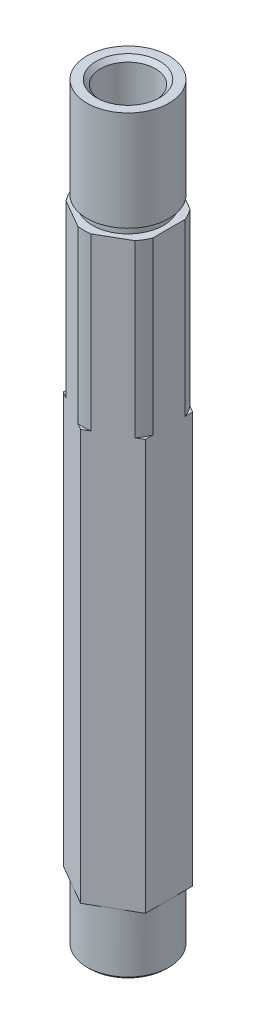
ISO-10303-21;
HEADER;
FILE_DESCRIPTION(('STEP AP214'),'2;1');
FILE_NAME('part.step','',(''),(''),'','','');
FILE_SCHEMA(('AUTOMOTIVE_DESIGN { 1 0 10303 214 1 1 1 1 }'));
ENDSEC;
DATA;
#1=APPLICATION_CONTEXT('core data for automotive mechanical design processes');
#2=APPLICATION_PROTOCOL_DEFINITION('international standard','automotive_design',2000,#1);
#3=PRODUCT_CONTEXT('',#1,'mechanical');
#4=PRODUCT('Part','Part','',(#3));
#5=PRODUCT_RELATED_PRODUCT_CATEGORY('part','',(#4));
#6=PRODUCT_DEFINITION_FORMATION('','',#4);
#7=PRODUCT_DEFINITION_CONTEXT('part definition',#1,'design');
#8=PRODUCT_DEFINITION('design','',#6,#7);
#9=PRODUCT_DEFINITION_SHAPE('','',#8);
#10=(LENGTH_UNIT() NAMED_UNIT(*) SI_UNIT(.MILLI.,.METRE.));
#11=(NAMED_UNIT(*) PLANE_ANGLE_UNIT() SI_UNIT($,.RADIAN.));
#12=(NAMED_UNIT(*) SI_UNIT($,.STERADIAN.) SOLID_ANGLE_UNIT());
#13=UNCERTAINTY_MEASURE_WITH_UNIT(LENGTH_MEASURE(1.E-05),#10,'distance_accuracy_value','');
#14=(GEOMETRIC_REPRESENTATION_CONTEXT(3) GLOBAL_UNCERTAINTY_ASSIGNED_CONTEXT((#13)) GLOBAL_UNIT_ASSIGNED_CONTEXT((#10,
#11,#12)) REPRESENTATION_CONTEXT('',''));
#15=CARTESIAN_POINT('',(0.,0.,0.));
#16=DIRECTION('',(0.,0.,1.));
#17=DIRECTION('',(1.,0.,0.));
#18=AXIS2_PLACEMENT_3D('',#15,#16,#17);
#19=CARTESIAN_POINT('',(4.7625,77.1525,0.));
#20=DIRECTION('',(0.,1.,0.));
#21=DIRECTION('',(-1.,0.,0.));
#22=AXIS2_PLACEMENT_3D('',#19,#20,#21);
#23=PLANE('',#22);
#24=CARTESIAN_POINT('',(0.,77.1525,0.));
#25=DIRECTION('',(0.,1.,0.));
#26=DIRECTION('',(-1.,0.,0.));
#27=AXIS2_PLACEMENT_3D('',#24,#25,#26);
#28=CIRCLE('',#27,3.175);
#29=CARTESIAN_POINT('',(-3.175,77.1525,0.));
#30=VERTEX_POINT('',#29);
#31=EDGE_CURVE('E20',#30,#30,#28,.T.);
#32=ORIENTED_EDGE('',*,*,#31,.T.);
#33=EDGE_LOOP('',(#32));
#34=FACE_BOUND('',#33,.T.);
#35=ADVANCED_FACE('F17',(#34),#23,.T.);
#36=CARTESIAN_POINT('',(0.,82.1525,0.));
#37=DIRECTION('',(0.,1.,0.));
#38=DIRECTION('',(-1.,0.,0.));
#39=AXIS2_PLACEMENT_3D('',#36,#37,#38);
#40=CYLINDRICAL_SURFACE('',#39,3.175);
#41=ORIENTED_EDGE('',*,*,#31,.F.);
#42=EDGE_LOOP('',(#41));
#43=FACE_BOUND('',#42,.T.);
#44=CARTESIAN_POINT('',(0.,86.6524999999569,0.));
#45=DIRECTION('',(0.,1.,0.));
#46=DIRECTION('',(-1.,0.,0.));
#47=AXIS2_PLACEMENT_3D('',#44,#45,#46);
#48=CIRCLE('',#47,3.17499999999882);
#49=CARTESIAN_POINT('',(-3.17499999999882,86.6524999999569,0.));
#50=VERTEX_POINT('',#49);
#51=EDGE_CURVE('E363',#50,#50,#48,.T.);
#52=ORIENTED_EDGE('',*,*,#51,.T.);
#53=EDGE_LOOP('',(#52));
#54=FACE_BOUND('',#53,.T.);
#55=ADVANCED_FACE('F419',(#43,#54),#40,.F.);
#56=CARTESIAN_POINT('',(0.,87.152500000002,0.));
#57=DIRECTION('',(0.,1.,0.));
#58=DIRECTION('',(0.,0.,1.));
#59=AXIS2_PLACEMENT_3D('',#56,#57,#58);
#60=CONICAL_SURFACE('',#59,3.674999999987,0.785398163397448);
#61=CARTESIAN_POINT('',(0.,87.152500000002,0.));
#62=DIRECTION('',(0.,1.,0.));
#63=DIRECTION('',(0.,0.,1.));
#64=AXIS2_PLACEMENT_3D('',#61,#62,#63);
#65=CIRCLE('',#64,3.674999999987);
#66=CARTESIAN_POINT('',(0.,87.152500000002,3.674999999987));
#67=VERTEX_POINT('',#66);
#68=EDGE_CURVE('E366',#67,#67,#65,.F.);
#69=ORIENTED_EDGE('',*,*,#68,.F.);
#70=EDGE_LOOP('',(#69));
#71=FACE_BOUND('',#70,.T.);
#72=ORIENTED_EDGE('',*,*,#51,.F.);
#73=EDGE_LOOP('',(#72));
#74=FACE_BOUND('',#73,.T.);
#75=ADVANCED_FACE('F416',(#71,#74),#60,.F.);
#76=CARTESIAN_POINT('',(0.,87.1525,0.));
#77=DIRECTION('',(0.,1.,0.));
#78=DIRECTION('',(-1.,0.,0.));
#79=AXIS2_PLACEMENT_3D('',#76,#77,#78);
#80=PLANE('',#79);
#81=ORIENTED_EDGE('',*,*,#68,.T.);
#82=EDGE_LOOP('',(#81));
#83=FACE_BOUND('',#82,.T.);
#84=CARTESIAN_POINT('',(0.,87.1525,0.));
#85=DIRECTION('',(0.,1.,0.));
#86=DIRECTION('',(-1.,0.,0.));
#87=AXIS2_PLACEMENT_3D('',#84,#85,#86);
#88=CIRCLE('',#87,4.7625);
#89=CARTESIAN_POINT('',(-4.7625,87.1525,0.));
#90=VERTEX_POINT('',#89);
#91=EDGE_CURVE('E408',#90,#90,#88,.F.);
#92=ORIENTED_EDGE('',*,*,#91,.F.);
#93=EDGE_LOOP('',(#92));
#94=FACE_BOUND('',#93,.T.);
#95=ADVANCED_FACE('F413',(#83,#94),#80,.T.);
#96=CARTESIAN_POINT('',(0.,0.,0.));
#97=DIRECTION('',(0.,-1.,0.));
#98=DIRECTION('',(1.,0.,0.));
#99=AXIS2_PLACEMENT_3D('',#96,#97,#98);
#100=PLANE('',#99);
#101=CARTESIAN_POINT('',(0.,1.1368667509129E-10,0.));
#102=DIRECTION('',(0.,1.,0.));
#103=DIRECTION('',(-1.,0.,0.));
#104=AXIS2_PLACEMENT_3D('',#101,#102,#103);
#105=CIRCLE('',#104,4.44500000003245);
#106=CARTESIAN_POINT('',(-4.44500000003245,1.13686826879594E-10,0.));
#107=VERTEX_POINT('',#106);
#108=EDGE_CURVE('E170',#107,#107,#105,.T.);
#109=ORIENTED_EDGE('',*,*,#108,.F.);
#110=EDGE_LOOP('',(#109));
#111=FACE_BOUND('',#110,.T.);
#112=ADVANCED_FACE('F548',(#111),#100,.T.);
#113=CARTESIAN_POINT('',(0.,82.1525,0.));
#114=DIRECTION('',(0.,1.,0.));
#115=DIRECTION('',(-1.,0.,0.));
#116=AXIS2_PLACEMENT_3D('',#113,#114,#115);
#117=CYLINDRICAL_SURFACE('',#116,4.7625);
#118=CARTESIAN_POINT('',(0.,75.565,0.));
#119=DIRECTION('',(0.,1.,0.));
#120=DIRECTION('',(-1.,0.,0.));
#121=AXIS2_PLACEMENT_3D('',#118,#119,#120);
#122=CIRCLE('',#121,4.7625);
#123=CARTESIAN_POINT('',(-4.7625,75.565,0.));
#124=VERTEX_POINT('',#123);
#125=EDGE_CURVE('E399',#124,#124,#122,.F.);
#126=ORIENTED_EDGE('',*,*,#125,.F.);
#127=EDGE_LOOP('',(#126));
#128=FACE_BOUND('',#127,.T.);
#129=ORIENTED_EDGE('',*,*,#91,.T.);
#130=EDGE_LOOP('',(#129));
#131=FACE_BOUND('',#130,.T.);
#132=ADVANCED_FACE('F544',(#128,#131),#117,.T.);
#133=CARTESIAN_POINT('',(0.,0.317499999937354,0.));
#134=DIRECTION('',(0.,1.,0.));
#135=DIRECTION('',(-1.,0.,0.));
#136=AXIS2_PLACEMENT_3D('',#133,#134,#135);
#137=CONICAL_SURFACE('',#136,4.76249999991296,0.785398163486965);
#138=ORIENTED_EDGE('',*,*,#108,.T.);
#139=EDGE_LOOP('',(#138));
#140=FACE_BOUND('',#139,.T.);
#141=CARTESIAN_POINT('',(0.,0.3175,0.));
#142=DIRECTION('',(0.,-1.,0.));
#143=DIRECTION('',(0.,0.,-1.));
#144=AXIS2_PLACEMENT_3D('',#141,#142,#143);
#145=CIRCLE('',#144,4.7625);
#146=CARTESIAN_POINT('',(0.,0.3175,-4.7625));
#147=VERTEX_POINT('',#146);
#148=EDGE_CURVE('E358',#147,#147,#145,.F.);
#149=ORIENTED_EDGE('',*,*,#148,.F.);
#150=EDGE_LOOP('',(#149));
#151=FACE_BOUND('',#150,.T.);
#152=ADVANCED_FACE('F541',(#140,#151),#137,.T.);
#153=CARTESIAN_POINT('',(0.,64.643,0.));
#154=DIRECTION('',(0.,-1.,0.));
#155=DIRECTION('',(0.,0.,-1.));
#156=AXIS2_PLACEMENT_3D('',#153,#154,#155);
#157=CYLINDRICAL_SURFACE('',#156,5.1181);
#158=DIRECTION('',(0.,1.,0.));
#159=VECTOR('',#158,1.);
#160=CARTESIAN_POINT('',(0.757933634900285,77.1525,-5.06166812589223));
#161=LINE('',#160,#159);
#162=CARTESIAN_POINT('',(0.757933635083529,54.7369999999,-5.06166812578643));
#163=VERTEX_POINT('',#162);
#164=CARTESIAN_POINT('',(0.757933635079738,74.54900000035,-5.06166812578639));
#165=VERTEX_POINT('',#164);
#166=EDGE_CURVE('E164',#163,#165,#161,.T.);
#167=ORIENTED_EDGE('',*,*,#166,.F.);
#168=CARTESIAN_POINT('',(0.,54.7369999999,0.));
#169=DIRECTION('',(0.,-1.,0.));
#170=DIRECTION('',(0.,0.,-1.));
#171=AXIS2_PLACEMENT_3D('',#168,#169,#170);
#172=CIRCLE('',#171,5.1181);
#173=CARTESIAN_POINT('',(-0.757933635085047,54.7369999999,-5.06166812579254));
#174=VERTEX_POINT('',#173);
#175=EDGE_CURVE('E169',#174,#163,#172,.T.);
#176=ORIENTED_EDGE('',*,*,#175,.F.);
#177=DIRECTION('',(0.,1.,0.));
#178=VECTOR('',#177,1.);
#179=CARTESIAN_POINT('',(-0.75793363488698,77.1525,-5.06166812590689));
#180=LINE('',#179,#178);
#181=CARTESIAN_POINT('',(-0.757933635073302,74.54900000035,-5.06166812579243));
#182=VERTEX_POINT('',#181);
#183=EDGE_CURVE('E167',#182,#174,#180,.F.);
#184=ORIENTED_EDGE('',*,*,#183,.F.);
#185=CARTESIAN_POINT('',(0.,74.5490000007,0.));
#186=DIRECTION('',(0.,-1.,0.));
#187=DIRECTION('',(0.,0.,-1.));
#188=AXIS2_PLACEMENT_3D('',#185,#186,#187);
#189=CIRCLE('',#188,5.1181);
#190=EDGE_CURVE('E158',#182,#165,#189,.T.);
#191=ORIENTED_EDGE('',*,*,#190,.T.);
#192=EDGE_LOOP('',(#167,#176,#184,#191));
#193=FACE_BOUND('',#192,.T.);
#194=ADVANCED_FACE('F163',(#193),#157,.T.);
#195=CARTESIAN_POINT('',(6.,54.737,0.));
#196=DIRECTION('',(0.,1.,0.));
#197=DIRECTION('',(-1.,0.,0.));
#198=AXIS2_PLACEMENT_3D('',#195,#196,#197);
#199=PLANE('',#198);
#200=ORIENTED_EDGE('',*,*,#175,.T.);
#201=DIRECTION('',(-0.866025403784329,0.,-0.50000000000019));
#202=VECTOR('',#201,1.);
#203=CARTESIAN_POINT('',(0.,54.7369999999,-5.49926131403));
#204=LINE('',#203,#202);
#205=CARTESIAN_POINT('',(-3.53126768375688E-12,54.7369999999,-5.49926131403437));
#206=VERTEX_POINT('',#205);
#207=EDGE_CURVE('E178',#206,#163,#204,.F.);
#208=ORIENTED_EDGE('',*,*,#207,.F.);
#209=DIRECTION('',(-0.866025403784329,0.,0.50000000000019));
#210=VECTOR('',#209,1.);
#211=CARTESIAN_POINT('',(-4.7625,54.7369999999,-2.74963065702));
#212=LINE('',#211,#210);
#213=EDGE_CURVE('E282',#174,#206,#212,.F.);
#214=ORIENTED_EDGE('',*,*,#213,.F.);
#215=EDGE_LOOP('',(#200,#208,#214));
#216=FACE_BOUND('',#215,.T.);
#217=ADVANCED_FACE('F534',(#216),#199,.T.);
#218=CARTESIAN_POINT('',(4.7625,7.112,0.));
#219=DIRECTION('',(0.,-1.,0.));
#220=DIRECTION('',(1.,0.,0.));
#221=AXIS2_PLACEMENT_3D('',#218,#219,#220);
#222=PLANE('',#221);
#223=CARTESIAN_POINT('',(0.,7.112,0.));
#224=DIRECTION('',(0.,-1.,0.));
#225=DIRECTION('',(0.,0.,-1.));
#226=AXIS2_PLACEMENT_3D('',#223,#224,#225);
#227=CIRCLE('',#226,4.7625);
#228=CARTESIAN_POINT('',(2.38125000000078,7.111999999935,-4.124445985522));
#229=VERTEX_POINT('',#228);
#230=CARTESIAN_POINT('',(-2.38125000017962,7.111999999935,-4.12444598542224));
#231=VERTEX_POINT('',#230);
#232=EDGE_CURVE('E402',#229,#231,#227,.F.);
#233=ORIENTED_EDGE('',*,*,#232,.T.);
#234=DIRECTION('',(-0.866025403784329,0.,0.50000000000019));
#235=VECTOR('',#234,1.);
#236=CARTESIAN_POINT('',(-4.7625,7.11199999988001,-2.74963065702));
#237=LINE('',#236,#235);
#238=CARTESIAN_POINT('',(-2.01989116151132E-12,7.11199999989667,-5.49926131403349));
#239=VERTEX_POINT('',#238);
#240=EDGE_CURVE('E337',#239,#231,#237,.T.);
#241=ORIENTED_EDGE('',*,*,#240,.F.);
#242=DIRECTION('',(-0.866025403784329,0.,-0.50000000000019));
#243=VECTOR('',#242,1.);
#244=CARTESIAN_POINT('',(0.,7.11199999987,-5.49926131403));
#245=LINE('',#244,#243);
#246=EDGE_CURVE('E310',#229,#239,#245,.T.);
#247=ORIENTED_EDGE('',*,*,#246,.F.);
#248=EDGE_LOOP('',(#233,#241,#247));
#249=FACE_BOUND('',#248,.T.);
#250=ADVANCED_FACE('F530',(#249),#222,.T.);
#251=CARTESIAN_POINT('',(4.1275,75.565,0.));
#252=DIRECTION('',(0.,-1.,0.));
#253=DIRECTION('',(1.,0.,0.));
#254=AXIS2_PLACEMENT_3D('',#251,#252,#253);
#255=PLANE('',#254);
#256=CARTESIAN_POINT('',(0.,75.565,0.));
#257=DIRECTION('',(0.,-1.,0.));
#258=DIRECTION('',(0.,0.,-1.));
#259=AXIS2_PLACEMENT_3D('',#256,#257,#258);
#260=CIRCLE('',#259,4.1275);
#261=CARTESIAN_POINT('',(0.,75.565,-4.1275));
#262=VERTEX_POINT('',#261);
#263=EDGE_CURVE('E340',#262,#262,#260,.T.);
#264=ORIENTED_EDGE('',*,*,#263,.F.);
#265=EDGE_LOOP('',(#264));
#266=FACE_BOUND('',#265,.T.);
#267=ORIENTED_EDGE('',*,*,#125,.T.);
#268=EDGE_LOOP('',(#267));
#269=FACE_BOUND('',#268,.T.);
#270=ADVANCED_FACE('F526',(#266,#269),#255,.T.);
#271=CARTESIAN_POINT('',(0.,64.643,0.));
#272=DIRECTION('',(0.,-1.,0.));
#273=DIRECTION('',(0.,0.,-1.));
#274=AXIS2_PLACEMENT_3D('',#271,#272,#273);
#275=CYLINDRICAL_SURFACE('',#274,5.1181);
#276=DIRECTION('',(0.,1.,0.));
#277=VECTOR('',#276,1.);
#278=CARTESIAN_POINT('',(-4.00456636510329,77.1525,-3.18722384515571));
#279=LINE('',#278,#277);
#280=CARTESIAN_POINT('',(-4.0045663649132,54.7369999999,-3.18722384526546));
#281=VERTEX_POINT('',#280);
#282=CARTESIAN_POINT('',(-4.00456636491798,74.54900000035,-3.18722384525699));
#283=VERTEX_POINT('',#282);
#284=EDGE_CURVE('E283',#281,#283,#279,.T.);
#285=ORIENTED_EDGE('',*,*,#284,.F.);
#286=CARTESIAN_POINT('',(0.,54.7369999999,0.));
#287=DIRECTION('',(0.,-1.,0.));
#288=DIRECTION('',(0.,0.,-1.));
#289=AXIS2_PLACEMENT_3D('',#286,#287,#288);
#290=CIRCLE('',#289,5.1181);
#291=CARTESIAN_POINT('',(-4.7625,54.7369999999,-1.87444428053674));
#292=VERTEX_POINT('',#291);
#293=EDGE_CURVE('E395',#292,#281,#290,.T.);
#294=ORIENTED_EDGE('',*,*,#293,.F.);
#295=DIRECTION('',(0.,1.,0.));
#296=VECTOR('',#295,1.);
#297=CARTESIAN_POINT('',(-4.7625,77.1525,-1.87444428076));
#298=LINE('',#297,#296);
#299=CARTESIAN_POINT('',(-4.7625,74.54900000035,-1.87444428053675));
#300=VERTEX_POINT('',#299);
#301=EDGE_CURVE('E276',#300,#292,#298,.F.);
#302=ORIENTED_EDGE('',*,*,#301,.F.);
#303=CARTESIAN_POINT('',(0.,74.5490000007,0.));
#304=DIRECTION('',(0.,-1.,0.));
#305=DIRECTION('',(0.,0.,-1.));
#306=AXIS2_PLACEMENT_3D('',#303,#304,#305);
#307=CIRCLE('',#306,5.1181);
#308=EDGE_CURVE('E397',#300,#283,#307,.T.);
#309=ORIENTED_EDGE('',*,*,#308,.T.);
#310=EDGE_LOOP('',(#285,#294,#302,#309));
#311=FACE_BOUND('',#310,.T.);
#312=ADVANCED_FACE('F522',(#311),#275,.T.);
#313=CARTESIAN_POINT('',(6.,54.737,0.));
#314=DIRECTION('',(0.,1.,0.));
#315=DIRECTION('',(-1.,0.,0.));
#316=AXIS2_PLACEMENT_3D('',#313,#314,#315);
#317=PLANE('',#316);
#318=ORIENTED_EDGE('',*,*,#293,.T.);
#319=DIRECTION('',(-0.866025403784329,0.,0.50000000000019));
#320=VECTOR('',#319,1.);
#321=CARTESIAN_POINT('',(-4.7625,54.7369999999,-2.74963065702));
#322=LINE('',#321,#320);
#323=CARTESIAN_POINT('',(-4.7625,54.7369999999,-2.74963065702));
#324=VERTEX_POINT('',#323);
#325=EDGE_CURVE('E286',#324,#281,#322,.F.);
#326=ORIENTED_EDGE('',*,*,#325,.F.);
#327=DIRECTION('',(0.,0.,1.));
#328=VECTOR('',#327,1.);
#329=CARTESIAN_POINT('',(-4.7625,54.7369999999,2.74963065702));
#330=LINE('',#329,#328);
#331=EDGE_CURVE('E279',#292,#324,#330,.F.);
#332=ORIENTED_EDGE('',*,*,#331,.F.);
#333=EDGE_LOOP('',(#318,#326,#332));
#334=FACE_BOUND('',#333,.T.);
#335=ADVANCED_FACE('F518',(#334),#317,.T.);
#336=CARTESIAN_POINT('',(4.7625,7.112,0.));
#337=DIRECTION('',(0.,-1.,0.));
#338=DIRECTION('',(1.,0.,0.));
#339=AXIS2_PLACEMENT_3D('',#336,#337,#338);
#340=PLANE('',#339);
#341=DIRECTION('',(-0.866025403784329,0.,0.50000000000019));
#342=VECTOR('',#341,1.);
#343=CARTESIAN_POINT('',(-4.7625,7.11199999999999,-2.74963065702));
#344=LINE('',#343,#342);
#345=CARTESIAN_POINT('',(-4.7625,7.11199999994,-2.74963065702));
#346=VERTEX_POINT('',#345);
#347=EDGE_CURVE('E304',#231,#346,#344,.T.);
#348=ORIENTED_EDGE('',*,*,#347,.F.);
#349=CARTESIAN_POINT('',(0.,7.11199999987,0.));
#350=DIRECTION('',(0.,-1.,0.));
#351=DIRECTION('',(0.,0.,-1.));
#352=AXIS2_PLACEMENT_3D('',#349,#350,#351);
#353=CIRCLE('',#352,4.7625);
#354=CARTESIAN_POINT('',(-4.7625,7.111999999935,0.));
#355=VERTEX_POINT('',#354);
#356=EDGE_CURVE('E362',#231,#355,#353,.F.);
#357=ORIENTED_EDGE('',*,*,#356,.T.);
#358=DIRECTION('',(0.,0.,1.));
#359=VECTOR('',#358,1.);
#360=CARTESIAN_POINT('',(-4.7625,7.11199999988001,2.74963065702));
#361=LINE('',#360,#359);
#362=EDGE_CURVE('E243',#346,#355,#361,.T.);
#363=ORIENTED_EDGE('',*,*,#362,.F.);
#364=EDGE_LOOP('',(#348,#357,#363));
#365=FACE_BOUND('',#364,.T.);
#366=ADVANCED_FACE('F514',(#365),#340,.T.);
#367=CARTESIAN_POINT('',(0.,3.556,0.));
#368=DIRECTION('',(0.,-1.,0.));
#369=DIRECTION('',(0.,0.,-1.));
#370=AXIS2_PLACEMENT_3D('',#367,#368,#369);
#371=CYLINDRICAL_SURFACE('',#370,4.7625);
#372=ORIENTED_EDGE('',*,*,#148,.T.);
#373=EDGE_LOOP('',(#372));
#374=FACE_BOUND('',#373,.T.);
#375=CARTESIAN_POINT('',(0.,7.11199999987,0.));
#376=DIRECTION('',(0.,-1.,0.));
#377=DIRECTION('',(0.,0.,-1.));
#378=AXIS2_PLACEMENT_3D('',#375,#376,#377);
#379=CIRCLE('',#378,4.7625);
#380=CARTESIAN_POINT('',(-2.38125000000078,7.11199999987,4.124445985522));
#381=VERTEX_POINT('',#380);
#382=CARTESIAN_POINT('',(2.38125000000229,7.11199999987,4.12444598552462));
#383=VERTEX_POINT('',#382);
#384=EDGE_CURVE('E381',#381,#383,#379,.F.);
#385=ORIENTED_EDGE('',*,*,#384,.F.);
#386=CARTESIAN_POINT('',(0.,7.11199999987,0.));
#387=DIRECTION('',(0.,-1.,0.));
#388=DIRECTION('',(0.,0.,-1.));
#389=AXIS2_PLACEMENT_3D('',#386,#387,#388);
#390=CIRCLE('',#389,4.7625);
#391=EDGE_CURVE('E242',#355,#381,#390,.F.);
#392=ORIENTED_EDGE('',*,*,#391,.F.);
#393=ORIENTED_EDGE('',*,*,#356,.F.);
#394=ORIENTED_EDGE('',*,*,#232,.F.);
#395=CARTESIAN_POINT('',(0.,7.11199999987,0.));
#396=DIRECTION('',(0.,-1.,0.));
#397=DIRECTION('',(0.,0.,-1.));
#398=AXIS2_PLACEMENT_3D('',#395,#396,#397);
#399=CIRCLE('',#398,4.7625);
#400=CARTESIAN_POINT('',(4.7625,7.111999999875,0.));
#401=VERTEX_POINT('',#400);
#402=EDGE_CURVE('E361',#401,#229,#399,.F.);
#403=ORIENTED_EDGE('',*,*,#402,.F.);
#404=CARTESIAN_POINT('',(0.,7.11199999987,0.));
#405=DIRECTION('',(0.,-1.,0.));
#406=DIRECTION('',(0.,0.,-1.));
#407=AXIS2_PLACEMENT_3D('',#404,#405,#406);
#408=CIRCLE('',#407,4.7625);
#409=EDGE_CURVE('E220',#383,#401,#408,.F.);
#410=ORIENTED_EDGE('',*,*,#409,.F.);
#411=EDGE_LOOP('',(#385,#392,#393,#394,#403,#410));
#412=FACE_BOUND('',#411,.T.);
#413=ADVANCED_FACE('F510',(#374,#412),#371,.T.);
#414=CARTESIAN_POINT('',(4.7625,7.112,0.));
#415=DIRECTION('',(0.,-1.,0.));
#416=DIRECTION('',(1.,0.,0.));
#417=AXIS2_PLACEMENT_3D('',#414,#415,#416);
#418=PLANE('',#417);
#419=ORIENTED_EDGE('',*,*,#402,.T.);
#420=DIRECTION('',(-0.866025403784329,0.,-0.50000000000019));
#421=VECTOR('',#420,1.);
#422=CARTESIAN_POINT('',(0.,7.11199999988001,-5.49926131403));
#423=LINE('',#422,#421);
#424=CARTESIAN_POINT('',(4.76249999999899,7.11199999987334,-2.74963065701825));
#425=VERTEX_POINT('',#424);
#426=EDGE_CURVE('E307',#425,#229,#423,.T.);
#427=ORIENTED_EDGE('',*,*,#426,.F.);
#428=DIRECTION('',(0.,0.,-1.));
#429=VECTOR('',#428,1.);
#430=CARTESIAN_POINT('',(4.7625,7.11199999987,-2.74963065702));
#431=LINE('',#430,#429);
#432=EDGE_CURVE('E219',#401,#425,#431,.T.);
#433=ORIENTED_EDGE('',*,*,#432,.F.);
#434=EDGE_LOOP('',(#419,#427,#433));
#435=FACE_BOUND('',#434,.T.);
#436=ADVANCED_FACE('F506',(#435),#418,.T.);
#437=CARTESIAN_POINT('',(6.,54.737,0.));
#438=DIRECTION('',(0.,1.,0.));
#439=DIRECTION('',(-1.,0.,0.));
#440=AXIS2_PLACEMENT_3D('',#437,#438,#439);
#441=PLANE('',#440);
#442=DIRECTION('',(-0.866025403784329,0.,-0.50000000000019));
#443=VECTOR('',#442,1.);
#444=CARTESIAN_POINT('',(0.,54.7369999999,-5.49926131403));
#445=LINE('',#444,#443);
#446=CARTESIAN_POINT('',(4.0045663649265,54.7369999999,-3.18722384525079));
#447=VERTEX_POINT('',#446);
#448=CARTESIAN_POINT('',(4.76249999999899,54.7369999999167,-2.74963065701825));
#449=VERTEX_POINT('',#448);
#450=EDGE_CURVE('E287',#447,#449,#445,.F.);
#451=ORIENTED_EDGE('',*,*,#450,.F.);
#452=CARTESIAN_POINT('',(0.,54.7369999999,0.));
#453=DIRECTION('',(0.,-1.,0.));
#454=DIRECTION('',(0.,0.,-1.));
#455=AXIS2_PLACEMENT_3D('',#452,#453,#454);
#456=CIRCLE('',#455,5.1181);
#457=CARTESIAN_POINT('',(4.7625,54.7369999999,-1.87444428052675));
#458=VERTEX_POINT('',#457);
#459=EDGE_CURVE('E390',#458,#447,#456,.F.);
#460=ORIENTED_EDGE('',*,*,#459,.F.);
#461=DIRECTION('',(0.,0.,-1.));
#462=VECTOR('',#461,1.);
#463=CARTESIAN_POINT('',(4.7625,54.7369999999,-2.74963065702));
#464=LINE('',#463,#462);
#465=EDGE_CURVE('E291',#449,#458,#464,.F.);
#466=ORIENTED_EDGE('',*,*,#465,.F.);
#467=EDGE_LOOP('',(#451,#460,#466));
#468=FACE_BOUND('',#467,.T.);
#469=ADVANCED_FACE('F502',(#468),#441,.T.);
#470=CARTESIAN_POINT('',(0.,64.643,0.));
#471=DIRECTION('',(0.,-1.,0.));
#472=DIRECTION('',(0.,0.,-1.));
#473=AXIS2_PLACEMENT_3D('',#470,#471,#472);
#474=CYLINDRICAL_SURFACE('',#473,5.1181);
#475=DIRECTION('',(0.,1.,0.));
#476=VECTOR('',#475,1.);
#477=CARTESIAN_POINT('',(4.0045663651196,77.1525,-3.18722384513931));
#478=LINE('',#477,#476);
#479=CARTESIAN_POINT('',(4.00456636492592,74.54900000035,-3.18722384525182));
#480=VERTEX_POINT('',#479);
#481=EDGE_CURVE('E179',#480,#447,#478,.F.);
#482=ORIENTED_EDGE('',*,*,#481,.F.);
#483=CARTESIAN_POINT('',(0.,74.5490000007,0.));
#484=DIRECTION('',(0.,-1.,0.));
#485=DIRECTION('',(0.,0.,-1.));
#486=AXIS2_PLACEMENT_3D('',#483,#484,#485);
#487=CIRCLE('',#486,5.1181);
#488=CARTESIAN_POINT('',(4.7625,74.54900000035,-1.87444428052675));
#489=VERTEX_POINT('',#488);
#490=EDGE_CURVE('E184',#480,#489,#487,.T.);
#491=ORIENTED_EDGE('',*,*,#490,.T.);
#492=DIRECTION('',(0.,1.,0.));
#493=VECTOR('',#492,1.);
#494=CARTESIAN_POINT('',(4.7625,77.1525,-1.87444428074));
#495=LINE('',#494,#493);
#496=EDGE_CURVE('E208',#458,#489,#495,.T.);
#497=ORIENTED_EDGE('',*,*,#496,.F.);
#498=ORIENTED_EDGE('',*,*,#459,.T.);
#499=EDGE_LOOP('',(#482,#491,#497,#498));
#500=FACE_BOUND('',#499,.T.);
#501=ADVANCED_FACE('F499',(#500),#474,.T.);
#502=CARTESIAN_POINT('',(0.,77.1525,-5.49926131403));
#503=DIRECTION('',(0.50000000000019,0.,-0.866025403784329));
#504=DIRECTION('',(-0.866025403784329,0.,-0.50000000000019));
#505=AXIS2_PLACEMENT_3D('',#502,#503,#504);
#506=PLANE('',#505);
#507=ORIENTED_EDGE('',*,*,#450,.T.);
#508=DIRECTION('',(0.,1.,0.));
#509=VECTOR('',#508,1.);
#510=CARTESIAN_POINT('',(4.7625,77.1525,-2.74963065702));
#511=LINE('',#510,#509);
#512=EDGE_CURVE('E296',#425,#449,#511,.T.);
#513=ORIENTED_EDGE('',*,*,#512,.F.);
#514=ORIENTED_EDGE('',*,*,#426,.T.);
#515=ORIENTED_EDGE('',*,*,#246,.T.);
#516=DIRECTION('',(0.,1.,0.));
#517=VECTOR('',#516,1.);
#518=CARTESIAN_POINT('',(-3.02709246557953E-12,77.1525,-5.49926131403524));
#519=LINE('',#518,#517);
#520=EDGE_CURVE('E341',#206,#239,#519,.F.);
#521=ORIENTED_EDGE('',*,*,#520,.F.);
#522=ORIENTED_EDGE('',*,*,#207,.T.);
#523=ORIENTED_EDGE('',*,*,#166,.T.);
#524=DIRECTION('',(-0.866025403784779,0.,-0.499999999999411));
#525=VECTOR('',#524,1.);
#526=CARTESIAN_POINT('',(4.00456636512,74.549,-3.18722384514));
#527=LINE('',#526,#525);
#528=EDGE_CURVE('E176',#480,#165,#527,.T.);
#529=ORIENTED_EDGE('',*,*,#528,.F.);
#530=ORIENTED_EDGE('',*,*,#481,.T.);
#531=EDGE_LOOP('',(#507,#513,#514,#515,#521,#522,#523,#529,#530));
#532=FACE_BOUND('',#531,.T.);
#533=ADVANCED_FACE('F174',(#532),#506,.T.);
#534=CARTESIAN_POINT('',(-4.7625,77.1525,-2.74963065702));
#535=DIRECTION('',(-0.50000000000019,0.,-0.866025403784329));
#536=DIRECTION('',(-0.866025403784329,0.,0.50000000000019));
#537=AXIS2_PLACEMENT_3D('',#534,#535,#536);
#538=PLANE('',#537);
#539=ORIENTED_EDGE('',*,*,#520,.T.);
#540=ORIENTED_EDGE('',*,*,#240,.T.);
#541=ORIENTED_EDGE('',*,*,#347,.T.);
#542=DIRECTION('',(0.,1.,0.));
#543=VECTOR('',#542,1.);
#544=CARTESIAN_POINT('',(-4.7625,77.1525,-2.74963065702));
#545=LINE('',#544,#543);
#546=EDGE_CURVE('E319',#324,#346,#545,.F.);
#547=ORIENTED_EDGE('',*,*,#546,.F.);
#548=ORIENTED_EDGE('',*,*,#325,.T.);
#549=ORIENTED_EDGE('',*,*,#284,.T.);
#550=DIRECTION('',(-0.866025403784512,0.,0.499999999999873));
#551=VECTOR('',#550,1.);
#552=CARTESIAN_POINT('',(-0.757933634883,74.549,-5.0616681259));
#553=LINE('',#552,#551);
#554=EDGE_CURVE('E186',#182,#283,#553,.T.);
#555=ORIENTED_EDGE('',*,*,#554,.F.);
#556=ORIENTED_EDGE('',*,*,#183,.T.);
#557=ORIENTED_EDGE('',*,*,#213,.T.);
#558=EDGE_LOOP('',(#539,#540,#541,#547,#548,#549,#555,#556,#557));
#559=FACE_BOUND('',#558,.T.);
#560=ADVANCED_FACE('F492',(#559),#538,.T.);
#561=CARTESIAN_POINT('',(0.,75.057,0.));
#562=DIRECTION('',(0.,-1.,0.));
#563=DIRECTION('',(0.,0.,-1.));
#564=AXIS2_PLACEMENT_3D('',#561,#562,#563);
#565=CYLINDRICAL_SURFACE('',#564,4.1275);
#566=ORIENTED_EDGE('',*,*,#263,.T.);
#567=EDGE_LOOP('',(#566));
#568=FACE_BOUND('',#567,.T.);
#569=CARTESIAN_POINT('',(0.,74.5490000006,0.));
#570=DIRECTION('',(0.,-1.,0.));
#571=DIRECTION('',(0.,0.,-1.));
#572=AXIS2_PLACEMENT_3D('',#569,#570,#571);
#573=CIRCLE('',#572,4.1275);
#574=CARTESIAN_POINT('',(0.,74.5490000006,-4.1275));
#575=VERTEX_POINT('',#574);
#576=EDGE_CURVE('E370',#575,#575,#573,.T.);
#577=ORIENTED_EDGE('',*,*,#576,.F.);
#578=EDGE_LOOP('',(#577));
#579=FACE_BOUND('',#578,.T.);
#580=ADVANCED_FACE('F488',(#568,#579),#565,.T.);
#581=CARTESIAN_POINT('',(0.,64.643,0.));
#582=DIRECTION('',(0.,-1.,0.));
#583=DIRECTION('',(0.,0.,-1.));
#584=AXIS2_PLACEMENT_3D('',#581,#582,#583);
#585=CYLINDRICAL_SURFACE('',#584,5.1181);
#586=DIRECTION('',(0.,1.,0.));
#587=VECTOR('',#586,1.);
#588=CARTESIAN_POINT('',(-4.7625,77.1525,1.87444428074));
#589=LINE('',#588,#587);
#590=CARTESIAN_POINT('',(-4.7625,54.7369999999,1.87444428052675));
#591=VERTEX_POINT('',#590);
#592=CARTESIAN_POINT('',(-4.7625,74.54900000035,1.87444428052675));
#593=VERTEX_POINT('',#592);
#594=EDGE_CURVE('E259',#591,#593,#589,.T.);
#595=ORIENTED_EDGE('',*,*,#594,.F.);
#596=CARTESIAN_POINT('',(0.,54.7369999999,0.));
#597=DIRECTION('',(0.,-1.,0.));
#598=DIRECTION('',(0.,0.,-1.));
#599=AXIS2_PLACEMENT_3D('',#596,#597,#598);
#600=CIRCLE('',#599,5.1181);
#601=CARTESIAN_POINT('',(-4.0045663649265,54.7369999999,3.18722384525079));
#602=VERTEX_POINT('',#601);
#603=EDGE_CURVE('E260',#602,#591,#600,.T.);
#604=ORIENTED_EDGE('',*,*,#603,.F.);
#605=DIRECTION('',(0.,1.,0.));
#606=VECTOR('',#605,1.);
#607=CARTESIAN_POINT('',(-4.0045663651196,77.1525,3.18722384513931));
#608=LINE('',#607,#606);
#609=CARTESIAN_POINT('',(-4.0045663649265,74.5490000007,3.18722384525079));
#610=VERTEX_POINT('',#609);
#611=EDGE_CURVE('E265',#610,#602,#608,.F.);
#612=ORIENTED_EDGE('',*,*,#611,.F.);
#613=CARTESIAN_POINT('',(0.,74.5490000007,0.));
#614=DIRECTION('',(0.,-1.,0.));
#615=DIRECTION('',(0.,0.,-1.));
#616=AXIS2_PLACEMENT_3D('',#613,#614,#615);
#617=CIRCLE('',#616,5.1181);
#618=EDGE_CURVE('E373',#593,#610,#617,.F.);
#619=ORIENTED_EDGE('',*,*,#618,.F.);
#620=EDGE_LOOP('',(#595,#604,#612,#619));
#621=FACE_BOUND('',#620,.T.);
#622=ADVANCED_FACE('F484',(#621),#585,.T.);
#623=CARTESIAN_POINT('',(6.,54.737,0.));
#624=DIRECTION('',(0.,1.,0.));
#625=DIRECTION('',(-1.,0.,0.));
#626=AXIS2_PLACEMENT_3D('',#623,#624,#625);
#627=PLANE('',#626);
#628=ORIENTED_EDGE('',*,*,#603,.T.);
#629=DIRECTION('',(0.,0.,1.));
#630=VECTOR('',#629,1.);
#631=CARTESIAN_POINT('',(-4.7625,54.7369999999,2.74963065702));
#632=LINE('',#631,#630);
#633=CARTESIAN_POINT('',(-4.76249999999798,54.7369999999,2.74963065701476));
#634=VERTEX_POINT('',#633);
#635=EDGE_CURVE('E256',#634,#591,#632,.F.);
#636=ORIENTED_EDGE('',*,*,#635,.F.);
#637=DIRECTION('',(0.866025403784329,0.,0.50000000000019));
#638=VECTOR('',#637,1.);
#639=CARTESIAN_POINT('',(0.,54.7369999999,5.49926131403));
#640=LINE('',#639,#638);
#641=EDGE_CURVE('E253',#602,#634,#640,.F.);
#642=ORIENTED_EDGE('',*,*,#641,.F.);
#643=EDGE_LOOP('',(#628,#636,#642));
#644=FACE_BOUND('',#643,.T.);
#645=ADVANCED_FACE('F480',(#644),#627,.T.);
#646=CARTESIAN_POINT('',(-4.7625,77.1525,2.74963065702));
#647=DIRECTION('',(-1.,0.,0.));
#648=DIRECTION('',(0.,0.,1.));
#649=AXIS2_PLACEMENT_3D('',#646,#647,#648);
#650=PLANE('',#649);
#651=ORIENTED_EDGE('',*,*,#546,.T.);
#652=ORIENTED_EDGE('',*,*,#362,.T.);
#653=DIRECTION('',(0.,0.,1.));
#654=VECTOR('',#653,1.);
#655=CARTESIAN_POINT('',(-4.7625,7.112,0.));
#656=LINE('',#655,#654);
#657=CARTESIAN_POINT('',(-4.76249999999798,7.11199999994,2.74963065701651));
#658=VERTEX_POINT('',#657);
#659=EDGE_CURVE('E239',#658,#355,#656,.F.);
#660=ORIENTED_EDGE('',*,*,#659,.F.);
#661=DIRECTION('',(0.,1.,0.));
#662=VECTOR('',#661,1.);
#663=CARTESIAN_POINT('',(-4.76249999999698,77.1525,2.74963065701476));
#664=LINE('',#663,#662);
#665=EDGE_CURVE('E248',#634,#658,#664,.F.);
#666=ORIENTED_EDGE('',*,*,#665,.F.);
#667=ORIENTED_EDGE('',*,*,#635,.T.);
#668=ORIENTED_EDGE('',*,*,#594,.T.);
#669=DIRECTION('',(0.,0.,1.));
#670=VECTOR('',#669,1.);
#671=CARTESIAN_POINT('',(-4.7625,74.549,0.));
#672=LINE('',#671,#670);
#673=EDGE_CURVE('E189',#300,#593,#672,.T.);
#674=ORIENTED_EDGE('',*,*,#673,.F.);
#675=ORIENTED_EDGE('',*,*,#301,.T.);
#676=ORIENTED_EDGE('',*,*,#331,.T.);
#677=EDGE_LOOP('',(#651,#652,#660,#666,#667,#668,#674,#675,#676));
#678=FACE_BOUND('',#677,.T.);
#679=ADVANCED_FACE('F476',(#678),#650,.T.);
#680=CARTESIAN_POINT('',(4.7625,7.112,0.));
#681=DIRECTION('',(0.,-1.,0.));
#682=DIRECTION('',(1.,0.,0.));
#683=AXIS2_PLACEMENT_3D('',#680,#681,#682);
#684=PLANE('',#683);
#685=ORIENTED_EDGE('',*,*,#659,.T.);
#686=ORIENTED_EDGE('',*,*,#391,.T.);
#687=DIRECTION('',(0.866025403784329,0.,0.50000000000019));
#688=VECTOR('',#687,1.);
#689=CARTESIAN_POINT('',(0.,7.11199999988001,5.49926131403));
#690=LINE('',#689,#688);
#691=EDGE_CURVE('E230',#658,#381,#690,.T.);
#692=ORIENTED_EDGE('',*,*,#691,.F.);
#693=EDGE_LOOP('',(#685,#686,#692));
#694=FACE_BOUND('',#693,.T.);
#695=ADVANCED_FACE('F472',(#694),#684,.T.);
#696=CARTESIAN_POINT('',(4.7625,7.112,0.));
#697=DIRECTION('',(0.,-1.,0.));
#698=DIRECTION('',(1.,0.,0.));
#699=AXIS2_PLACEMENT_3D('',#696,#697,#698);
#700=PLANE('',#699);
#701=DIRECTION('',(0.866025403784329,0.,0.50000000000019));
#702=VECTOR('',#701,1.);
#703=CARTESIAN_POINT('',(0.,7.11199999987,5.49926131403));
#704=LINE('',#703,#702);
#705=CARTESIAN_POINT('',(-7.94742121081155E-12,7.11199999987501,5.49926131403778));
#706=VERTEX_POINT('',#705);
#707=EDGE_CURVE('E233',#381,#706,#704,.T.);
#708=ORIENTED_EDGE('',*,*,#707,.F.);
#709=ORIENTED_EDGE('',*,*,#384,.T.);
#710=DIRECTION('',(0.866025403784329,0.,-0.50000000000019));
#711=VECTOR('',#710,1.);
#712=CARTESIAN_POINT('',(4.7625,7.11199999988001,2.74963065702));
#713=LINE('',#712,#711);
#714=EDGE_CURVE('E225',#706,#383,#713,.T.);
#715=ORIENTED_EDGE('',*,*,#714,.F.);
#716=EDGE_LOOP('',(#708,#709,#715));
#717=FACE_BOUND('',#716,.T.);
#718=ADVANCED_FACE('F468',(#717),#700,.T.);
#719=CARTESIAN_POINT('',(4.7625,7.112,0.));
#720=DIRECTION('',(0.,-1.,0.));
#721=DIRECTION('',(1.,0.,0.));
#722=AXIS2_PLACEMENT_3D('',#719,#720,#721);
#723=PLANE('',#722);
#724=ORIENTED_EDGE('',*,*,#409,.T.);
#725=DIRECTION('',(0.,0.,-1.));
#726=VECTOR('',#725,1.);
#727=CARTESIAN_POINT('',(4.7625,7.11199999988001,-2.74963065702));
#728=LINE('',#727,#726);
#729=CARTESIAN_POINT('',(4.7625,7.11199999987334,2.74963065702));
#730=VERTEX_POINT('',#729);
#731=EDGE_CURVE('E216',#730,#401,#728,.T.);
#732=ORIENTED_EDGE('',*,*,#731,.F.);
#733=DIRECTION('',(0.866025403784329,0.,-0.50000000000019));
#734=VECTOR('',#733,1.);
#735=CARTESIAN_POINT('',(4.7625,7.11199999987,2.74963065702));
#736=LINE('',#735,#734);
#737=EDGE_CURVE('E213',#383,#730,#736,.T.);
#738=ORIENTED_EDGE('',*,*,#737,.F.);
#739=EDGE_LOOP('',(#724,#732,#738));
#740=FACE_BOUND('',#739,.T.);
#741=ADVANCED_FACE('F464',(#740),#723,.T.);
#742=CARTESIAN_POINT('',(4.7625,77.1525,-2.74963065702));
#743=DIRECTION('',(1.,0.,0.));
#744=DIRECTION('',(0.,0.,-1.));
#745=AXIS2_PLACEMENT_3D('',#742,#743,#744);
#746=PLANE('',#745);
#747=DIRECTION('',(0.,0.,1.));
#748=VECTOR('',#747,1.);
#749=CARTESIAN_POINT('',(4.7625,54.737,0.));
#750=LINE('',#749,#748);
#751=CARTESIAN_POINT('',(4.7625,54.73699999995,2.74963065702));
#752=VERTEX_POINT('',#751);
#753=CARTESIAN_POINT('',(4.76249999992392,54.7369999999,1.87444428050681));
#754=VERTEX_POINT('',#753);
#755=EDGE_CURVE('E205',#752,#754,#750,.F.);
#756=ORIENTED_EDGE('',*,*,#755,.F.);
#757=DIRECTION('',(0.,1.,0.));
#758=VECTOR('',#757,1.);
#759=CARTESIAN_POINT('',(4.7625,77.1525,2.74963065702));
#760=LINE('',#759,#758);
#761=EDGE_CURVE('E202',#730,#752,#760,.T.);
#762=ORIENTED_EDGE('',*,*,#761,.F.);
#763=ORIENTED_EDGE('',*,*,#731,.T.);
#764=ORIENTED_EDGE('',*,*,#432,.T.);
#765=ORIENTED_EDGE('',*,*,#512,.T.);
#766=ORIENTED_EDGE('',*,*,#465,.T.);
#767=ORIENTED_EDGE('',*,*,#496,.T.);
#768=DIRECTION('',(0.,0.,1.));
#769=VECTOR('',#768,1.);
#770=CARTESIAN_POINT('',(4.7625,74.549,0.));
#771=LINE('',#770,#769);
#772=CARTESIAN_POINT('',(4.76249999996196,74.54900000035,1.87444428050681));
#773=VERTEX_POINT('',#772);
#774=EDGE_CURVE('E187',#773,#489,#771,.F.);
#775=ORIENTED_EDGE('',*,*,#774,.F.);
#776=DIRECTION('',(0.,-1.,0.));
#777=VECTOR('',#776,1.);
#778=CARTESIAN_POINT('',(4.76249999984784,64.643,1.87444428070011));
#779=LINE('',#778,#777);
#780=EDGE_CURVE('E292',#754,#773,#779,.F.);
#781=ORIENTED_EDGE('',*,*,#780,.F.);
#782=EDGE_LOOP('',(#756,#762,#763,#764,#765,#766,#767,#775,#781));
#783=FACE_BOUND('',#782,.T.);
#784=ADVANCED_FACE('F460',(#783),#746,.T.);
#785=CARTESIAN_POINT('',(6.,54.737,0.));
#786=DIRECTION('',(0.,1.,0.));
#787=DIRECTION('',(-1.,0.,0.));
#788=AXIS2_PLACEMENT_3D('',#785,#786,#787);
#789=PLANE('',#788);
#790=ORIENTED_EDGE('',*,*,#755,.T.);
#791=CARTESIAN_POINT('',(0.,54.7369999999,0.));
#792=DIRECTION('',(0.,-1.,0.));
#793=DIRECTION('',(0.,0.,-1.));
#794=AXIS2_PLACEMENT_3D('',#791,#792,#793);
#795=CIRCLE('',#794,5.1181);
#796=CARTESIAN_POINT('',(4.00456636491321,54.7369999999,3.18722384526545));
#797=VERTEX_POINT('',#796);
#798=EDGE_CURVE('E207',#797,#754,#795,.F.);
#799=ORIENTED_EDGE('',*,*,#798,.F.);
#800=DIRECTION('',(0.866025403784329,0.,-0.50000000000019));
#801=VECTOR('',#800,1.);
#802=CARTESIAN_POINT('',(4.7625,54.7369999999,2.74963065702));
#803=LINE('',#802,#801);
#804=EDGE_CURVE('E199',#752,#797,#803,.F.);
#805=ORIENTED_EDGE('',*,*,#804,.F.);
#806=EDGE_LOOP('',(#790,#799,#805));
#807=FACE_BOUND('',#806,.T.);
#808=ADVANCED_FACE('F456',(#807),#789,.T.);
#809=CARTESIAN_POINT('',(0.,64.643,0.));
#810=DIRECTION('',(0.,-1.,0.));
#811=DIRECTION('',(0.,0.,-1.));
#812=AXIS2_PLACEMENT_3D('',#809,#810,#811);
#813=CYLINDRICAL_SURFACE('',#812,5.1181);
#814=ORIENTED_EDGE('',*,*,#780,.T.);
#815=CARTESIAN_POINT('',(0.,74.5490000007,0.));
#816=DIRECTION('',(0.,-1.,0.));
#817=DIRECTION('',(0.,0.,-1.));
#818=AXIS2_PLACEMENT_3D('',#815,#816,#817);
#819=CIRCLE('',#818,5.1181);
#820=CARTESIAN_POINT('',(4.00456636491321,74.5490000007,3.18722384526545));
#821=VERTEX_POINT('',#820);
#822=EDGE_CURVE('E191',#821,#773,#819,.F.);
#823=ORIENTED_EDGE('',*,*,#822,.F.);
#824=DIRECTION('',(0.,1.,0.));
#825=VECTOR('',#824,1.);
#826=CARTESIAN_POINT('',(4.00456636510329,77.1525,3.18722384515571));
#827=LINE('',#826,#825);
#828=EDGE_CURVE('E195',#797,#821,#827,.T.);
#829=ORIENTED_EDGE('',*,*,#828,.F.);
#830=ORIENTED_EDGE('',*,*,#798,.T.);
#831=EDGE_LOOP('',(#814,#823,#829,#830));
#832=FACE_BOUND('',#831,.T.);
#833=ADVANCED_FACE('F452',(#832),#813,.T.);
#834=CARTESIAN_POINT('',(5.1181,74.549,0.));
#835=DIRECTION('',(0.,1.,0.));
#836=DIRECTION('',(-1.,0.,0.));
#837=AXIS2_PLACEMENT_3D('',#834,#835,#836);
#838=PLANE('',#837);
#839=ORIENTED_EDGE('',*,*,#576,.T.);
#840=EDGE_LOOP('',(#839));
#841=FACE_BOUND('',#840,.T.);
#842=ORIENTED_EDGE('',*,*,#673,.T.);
#843=ORIENTED_EDGE('',*,*,#618,.T.);
#844=DIRECTION('',(0.866025403784329,0.,0.50000000000019));
#845=VECTOR('',#844,1.);
#846=CARTESIAN_POINT('',(0.,74.5490000007,5.49926131403));
#847=LINE('',#846,#845);
#848=CARTESIAN_POINT('',(-0.75793363508353,74.5490000007,5.06166812578643));
#849=VERTEX_POINT('',#848);
#850=EDGE_CURVE('E270',#849,#610,#847,.F.);
#851=ORIENTED_EDGE('',*,*,#850,.F.);
#852=CARTESIAN_POINT('',(0.,74.5490000007,0.));
#853=DIRECTION('',(0.,-1.,0.));
#854=DIRECTION('',(0.,0.,-1.));
#855=AXIS2_PLACEMENT_3D('',#852,#853,#854);
#856=CIRCLE('',#855,5.1181);
#857=CARTESIAN_POINT('',(0.757933635085047,74.5490000007,5.06166812579254));
#858=VERTEX_POINT('',#857);
#859=EDGE_CURVE('E368',#858,#849,#856,.T.);
#860=ORIENTED_EDGE('',*,*,#859,.F.);
#861=DIRECTION('',(0.866025403784329,0.,-0.50000000000019));
#862=VECTOR('',#861,1.);
#863=CARTESIAN_POINT('',(4.7625,74.5490000007,2.74963065702));
#864=LINE('',#863,#862);
#865=EDGE_CURVE('E198',#821,#858,#864,.F.);
#866=ORIENTED_EDGE('',*,*,#865,.F.);
#867=ORIENTED_EDGE('',*,*,#822,.T.);
#868=ORIENTED_EDGE('',*,*,#774,.T.);
#869=ORIENTED_EDGE('',*,*,#490,.F.);
#870=ORIENTED_EDGE('',*,*,#528,.T.);
#871=ORIENTED_EDGE('',*,*,#190,.F.);
#872=ORIENTED_EDGE('',*,*,#554,.T.);
#873=ORIENTED_EDGE('',*,*,#308,.F.);
#874=EDGE_LOOP('',(#842,#843,#851,#860,#866,#867,#868,#869,#870,#871,#872,#873));
#875=FACE_BOUND('',#874,.T.);
#876=ADVANCED_FACE('F182',(#841,#875),#838,.T.);
#877=CARTESIAN_POINT('',(0.,64.643,0.));
#878=DIRECTION('',(0.,-1.,0.));
#879=DIRECTION('',(0.,0.,-1.));
#880=AXIS2_PLACEMENT_3D('',#877,#878,#879);
#881=CYLINDRICAL_SURFACE('',#880,5.1181);
#882=DIRECTION('',(0.,1.,0.));
#883=VECTOR('',#882,1.);
#884=CARTESIAN_POINT('',(0.75793363488698,77.1525,5.06166812590689));
#885=LINE('',#884,#883);
#886=CARTESIAN_POINT('',(0.757933635085046,54.7369999999,5.06166812579254));
#887=VERTEX_POINT('',#886);
#888=EDGE_CURVE('E796',#858,#887,#885,.F.);
#889=ORIENTED_EDGE('',*,*,#888,.F.);
#890=ORIENTED_EDGE('',*,*,#859,.T.);
#891=DIRECTION('',(0.,1.,0.));
#892=VECTOR('',#891,1.);
#893=CARTESIAN_POINT('',(-0.757933634900285,77.1525,5.06166812589223));
#894=LINE('',#893,#892);
#895=CARTESIAN_POINT('',(-0.75793363508353,54.7369999999,5.06166812578643));
#896=VERTEX_POINT('',#895);
#897=EDGE_CURVE('E273',#896,#849,#894,.T.);
#898=ORIENTED_EDGE('',*,*,#897,.F.);
#899=CARTESIAN_POINT('',(0.,54.7369999999,0.));
#900=DIRECTION('',(0.,-1.,0.));
#901=DIRECTION('',(0.,0.,-1.));
#902=AXIS2_PLACEMENT_3D('',#899,#900,#901);
#903=CIRCLE('',#902,5.1181);
#904=EDGE_CURVE('E236',#887,#896,#903,.T.);
#905=ORIENTED_EDGE('',*,*,#904,.F.);
#906=EDGE_LOOP('',(#889,#890,#898,#905));
#907=FACE_BOUND('',#906,.T.);
#908=ADVANCED_FACE('F446',(#907),#881,.T.);
#909=CARTESIAN_POINT('',(6.,54.737,0.));
#910=DIRECTION('',(0.,1.,0.));
#911=DIRECTION('',(-1.,0.,0.));
#912=AXIS2_PLACEMENT_3D('',#909,#910,#911);
#913=PLANE('',#912);
#914=DIRECTION('',(0.866025403784329,0.,-0.50000000000019));
#915=VECTOR('',#914,1.);
#916=CARTESIAN_POINT('',(4.7625,54.7369999999,2.74963065702));
#917=LINE('',#916,#915);
#918=CARTESIAN_POINT('',(-7.99366976397643E-12,54.7369999999167,5.49926131403775));
#919=VERTEX_POINT('',#918);
#920=EDGE_CURVE('E26',#887,#919,#917,.F.);
#921=ORIENTED_EDGE('',*,*,#920,.F.);
#922=ORIENTED_EDGE('',*,*,#904,.T.);
#923=DIRECTION('',(0.866025403784329,0.,0.50000000000019));
#924=VECTOR('',#923,1.);
#925=CARTESIAN_POINT('',(0.,54.7369999999,5.49926131403));
#926=LINE('',#925,#924);
#927=EDGE_CURVE('E35',#919,#896,#926,.F.);
#928=ORIENTED_EDGE('',*,*,#927,.F.);
#929=EDGE_LOOP('',(#921,#922,#928));
#930=FACE_BOUND('',#929,.T.);
#931=ADVANCED_FACE('F439',(#930),#913,.T.);
#932=CARTESIAN_POINT('',(0.,77.1525,5.49926131403));
#933=DIRECTION('',(-0.50000000000019,0.,0.866025403784329));
#934=DIRECTION('',(0.866025403784329,0.,0.50000000000019));
#935=AXIS2_PLACEMENT_3D('',#932,#933,#934);
#936=PLANE('',#935);
#937=ORIENTED_EDGE('',*,*,#665,.T.);
#938=ORIENTED_EDGE('',*,*,#691,.T.);
#939=ORIENTED_EDGE('',*,*,#707,.T.);
#940=DIRECTION('',(0.,1.,0.));
#941=VECTOR('',#940,1.);
#942=CARTESIAN_POINT('',(-1.31127747549087E-11,77.1525,5.49926131404456));
#943=LINE('',#942,#941);
#944=EDGE_CURVE('E11',#919,#706,#943,.F.);
#945=ORIENTED_EDGE('',*,*,#944,.F.);
#946=ORIENTED_EDGE('',*,*,#927,.T.);
#947=ORIENTED_EDGE('',*,*,#897,.T.);
#948=ORIENTED_EDGE('',*,*,#850,.T.);
#949=ORIENTED_EDGE('',*,*,#611,.T.);
#950=ORIENTED_EDGE('',*,*,#641,.T.);
#951=EDGE_LOOP('',(#937,#938,#939,#945,#946,#947,#948,#949,#950));
#952=FACE_BOUND('',#951,.T.);
#953=ADVANCED_FACE('F433',(#952),#936,.T.);
#954=CARTESIAN_POINT('',(4.7625,77.1525,2.74963065702));
#955=DIRECTION('',(0.50000000000019,0.,0.866025403784329));
#956=DIRECTION('',(0.866025403784329,0.,-0.50000000000019));
#957=AXIS2_PLACEMENT_3D('',#954,#955,#956);
#958=PLANE('',#957);
#959=ORIENTED_EDGE('',*,*,#920,.T.);
#960=ORIENTED_EDGE('',*,*,#944,.T.);
#961=ORIENTED_EDGE('',*,*,#714,.T.);
#962=ORIENTED_EDGE('',*,*,#737,.T.);
#963=ORIENTED_EDGE('',*,*,#761,.T.);
#964=ORIENTED_EDGE('',*,*,#804,.T.);
#965=ORIENTED_EDGE('',*,*,#828,.T.);
#966=ORIENTED_EDGE('',*,*,#865,.T.);
#967=ORIENTED_EDGE('',*,*,#888,.T.);
#968=EDGE_LOOP('',(#959,#960,#961,#962,#963,#964,#965,#966,#967));
#969=FACE_BOUND('',#968,.T.);
#970=ADVANCED_FACE('F431',(#969),#958,.T.);
#971=CLOSED_SHELL('',(#35,#55,#75,#95,#112,#132,#152,#194,#217,#250,#270,#312,#335,#366,#413,
#436,#469,#501,#533,#560,#580,#622,#645,#679,#695,#718,#741,#784,#808,#833,#876,#908,#931,#953,#970));
#972=MANIFOLD_SOLID_BREP('B1',#971);
#973=ADVANCED_BREP_SHAPE_REPRESENTATION('',(#18,#972),#14);
#974=SHAPE_DEFINITION_REPRESENTATION(#9,#973);
ENDSEC;
END-ISO-10303-21;
